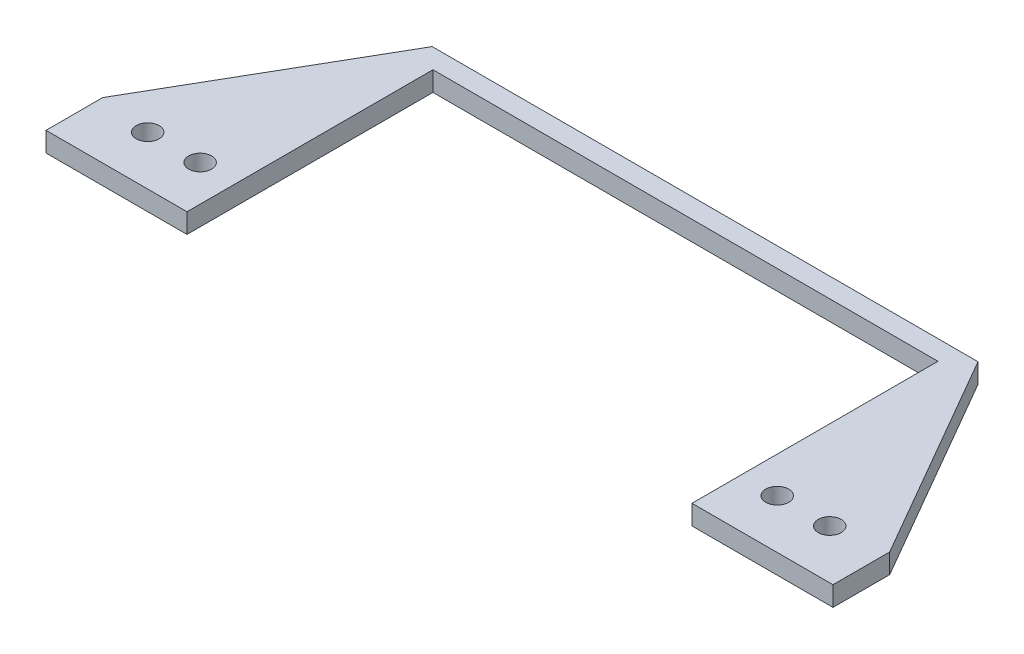
ISO-10303-21;
HEADER;
FILE_DESCRIPTION(('STEP AP214'),'2;1');
FILE_NAME('part.step','',(''),(''),'','','');
FILE_SCHEMA(('AUTOMOTIVE_DESIGN { 1 0 10303 214 1 1 1 1 }'));
ENDSEC;
DATA;
#1=APPLICATION_CONTEXT('core data for automotive mechanical design processes');
#2=APPLICATION_PROTOCOL_DEFINITION('international standard','automotive_design',2000,#1);
#3=PRODUCT_CONTEXT('',#1,'mechanical');
#4=PRODUCT('Part','Part','',(#3));
#5=PRODUCT_RELATED_PRODUCT_CATEGORY('part','',(#4));
#6=PRODUCT_DEFINITION_FORMATION('','',#4);
#7=PRODUCT_DEFINITION_CONTEXT('part definition',#1,'design');
#8=PRODUCT_DEFINITION('design','',#6,#7);
#9=PRODUCT_DEFINITION_SHAPE('','',#8);
#10=(LENGTH_UNIT() NAMED_UNIT(*) SI_UNIT(.MILLI.,.METRE.));
#11=(NAMED_UNIT(*) PLANE_ANGLE_UNIT() SI_UNIT($,.RADIAN.));
#12=(NAMED_UNIT(*) SI_UNIT($,.STERADIAN.) SOLID_ANGLE_UNIT());
#13=UNCERTAINTY_MEASURE_WITH_UNIT(LENGTH_MEASURE(1.E-05),#10,'distance_accuracy_value','');
#14=(GEOMETRIC_REPRESENTATION_CONTEXT(3) GLOBAL_UNCERTAINTY_ASSIGNED_CONTEXT((#13)) GLOBAL_UNIT_ASSIGNED_CONTEXT((#10,
#11,#12)) REPRESENTATION_CONTEXT('',''));
#15=CARTESIAN_POINT('',(0.,0.,0.));
#16=DIRECTION('',(0.,0.,1.));
#17=DIRECTION('',(1.,0.,0.));
#18=AXIS2_PLACEMENT_3D('',#15,#16,#17);
#19=CARTESIAN_POINT('',(41.6113939263104,3.,-23.0814356435643));
#20=DIRECTION('',(-0.866025403784438,0.,0.500000000000001));
#21=DIRECTION('',(0.500000000000001,0.,0.866025403784438));
#22=AXIS2_PLACEMENT_3D('',#19,#20,#21);
#23=PLANE('',#22);
#24=DIRECTION('',(-0.500000000000001,0.,-0.866025403784438));
#25=VECTOR('',#24,1.);
#26=CARTESIAN_POINT('',(41.6113939263104,0.,-23.0814356435643));
#27=LINE('',#26,#25);
#28=CARTESIAN_POINT('',(60.,0.,8.76856435643566));
#29=VERTEX_POINT('',#28);
#30=CARTESIAN_POINT('',(41.6113939263104,0.,-23.0814356435643));
#31=VERTEX_POINT('',#30);
#32=EDGE_CURVE('E141',#29,#31,#27,.T.);
#33=ORIENTED_EDGE('',*,*,#32,.T.);
#34=DIRECTION('',(0.,-1.,0.));
#35=VECTOR('',#34,1.);
#36=CARTESIAN_POINT('',(41.6113939263104,3.,-23.0814356435643));
#37=LINE('',#36,#35);
#38=CARTESIAN_POINT('',(41.6113939263104,3.,-23.0814356435643));
#39=VERTEX_POINT('',#38);
#40=EDGE_CURVE('E11',#39,#31,#37,.T.);
#41=ORIENTED_EDGE('',*,*,#40,.F.);
#42=DIRECTION('',(-0.500000000000001,0.,-0.866025403784438));
#43=VECTOR('',#42,1.);
#44=CARTESIAN_POINT('',(41.6113939263104,3.,-23.0814356435643));
#45=LINE('',#44,#43);
#46=CARTESIAN_POINT('',(60.,3.,8.76856435643566));
#47=VERTEX_POINT('',#46);
#48=EDGE_CURVE('E160',#47,#39,#45,.T.);
#49=ORIENTED_EDGE('',*,*,#48,.F.);
#50=DIRECTION('',(0.,-1.,0.));
#51=VECTOR('',#50,1.);
#52=CARTESIAN_POINT('',(60.,3.,8.76856435643566));
#53=LINE('',#52,#51);
#54=EDGE_CURVE('E137',#47,#29,#53,.T.);
#55=ORIENTED_EDGE('',*,*,#54,.T.);
#56=EDGE_LOOP('',(#33,#41,#49,#55));
#57=FACE_BOUND('',#56,.T.);
#58=ADVANCED_FACE('F33',(#57),#23,.F.);
#59=CARTESIAN_POINT('',(-41.6113939263104,3.,-23.0814356435643));
#60=DIRECTION('',(0.,0.,1.));
#61=DIRECTION('',(1.,0.,0.));
#62=AXIS2_PLACEMENT_3D('',#59,#60,#61);
#63=PLANE('',#62);
#64=DIRECTION('',(-1.,0.,0.));
#65=VECTOR('',#64,1.);
#66=CARTESIAN_POINT('',(-41.6113939263104,0.,-23.0814356435643));
#67=LINE('',#66,#65);
#68=CARTESIAN_POINT('',(-41.6113939263104,0.,-23.0814356435643));
#69=VERTEX_POINT('',#68);
#70=EDGE_CURVE('E144',#31,#69,#67,.T.);
#71=ORIENTED_EDGE('',*,*,#70,.T.);
#72=DIRECTION('',(0.,-1.,0.));
#73=VECTOR('',#72,1.);
#74=CARTESIAN_POINT('',(-41.6113939263104,3.,-23.0814356435643));
#75=LINE('',#74,#73);
#76=CARTESIAN_POINT('',(-41.6113939263104,3.,-23.0814356435643));
#77=VERTEX_POINT('',#76);
#78=EDGE_CURVE('E41',#77,#69,#75,.T.);
#79=ORIENTED_EDGE('',*,*,#78,.F.);
#80=DIRECTION('',(-1.,0.,0.));
#81=VECTOR('',#80,1.);
#82=CARTESIAN_POINT('',(-41.6113939263104,3.,-23.0814356435643));
#83=LINE('',#82,#81);
#84=EDGE_CURVE('E98',#39,#77,#83,.T.);
#85=ORIENTED_EDGE('',*,*,#84,.F.);
#86=ORIENTED_EDGE('',*,*,#40,.T.);
#87=EDGE_LOOP('',(#71,#79,#85,#86));
#88=FACE_BOUND('',#87,.T.);
#89=ADVANCED_FACE('F265',(#88),#63,.F.);
#90=CARTESIAN_POINT('',(-41.6113939263104,3.,-23.0814356435643));
#91=DIRECTION('',(0.866025403784438,0.,0.500000000000001));
#92=DIRECTION('',(0.500000000000001,0.,-0.866025403784438));
#93=AXIS2_PLACEMENT_3D('',#90,#91,#92);
#94=PLANE('',#93);
#95=DIRECTION('',(-0.500000000000001,0.,0.866025403784438));
#96=VECTOR('',#95,1.);
#97=CARTESIAN_POINT('',(-41.6113939263104,0.,-23.0814356435643));
#98=LINE('',#97,#96);
#99=CARTESIAN_POINT('',(-60.,0.,8.76856435643567));
#100=VERTEX_POINT('',#99);
#101=EDGE_CURVE('E147',#69,#100,#98,.T.);
#102=ORIENTED_EDGE('',*,*,#101,.T.);
#103=DIRECTION('',(0.,-1.,0.));
#104=VECTOR('',#103,1.);
#105=CARTESIAN_POINT('',(-60.,3.,8.76856435643567));
#106=LINE('',#105,#104);
#107=CARTESIAN_POINT('',(-60.,3.,8.76856435643567));
#108=VERTEX_POINT('',#107);
#109=EDGE_CURVE('E173',#108,#100,#106,.T.);
#110=ORIENTED_EDGE('',*,*,#109,.F.);
#111=DIRECTION('',(-0.500000000000001,0.,0.866025403784438));
#112=VECTOR('',#111,1.);
#113=CARTESIAN_POINT('',(-41.6113939263104,3.,-23.0814356435643));
#114=LINE('',#113,#112);
#115=EDGE_CURVE('E181',#77,#108,#114,.T.);
#116=ORIENTED_EDGE('',*,*,#115,.F.);
#117=ORIENTED_EDGE('',*,*,#78,.T.);
#118=EDGE_LOOP('',(#102,#110,#116,#117));
#119=FACE_BOUND('',#118,.T.);
#120=ADVANCED_FACE('F179',(#119),#94,.F.);
#121=CARTESIAN_POINT('',(-60.,3.,8.76856435643567));
#122=DIRECTION('',(1.,0.,0.));
#123=DIRECTION('',(0.,0.,-1.));
#124=AXIS2_PLACEMENT_3D('',#121,#122,#123);
#125=PLANE('',#124);
#126=DIRECTION('',(0.,0.,1.));
#127=VECTOR('',#126,1.);
#128=CARTESIAN_POINT('',(-60.,0.,8.76856435643567));
#129=LINE('',#128,#127);
#130=CARTESIAN_POINT('',(-60.,0.,17.4185643564357));
#131=VERTEX_POINT('',#130);
#132=EDGE_CURVE('E149',#100,#131,#129,.T.);
#133=ORIENTED_EDGE('',*,*,#132,.T.);
#134=DIRECTION('',(0.,-1.,0.));
#135=VECTOR('',#134,1.);
#136=CARTESIAN_POINT('',(-60.,3.,17.4185643564357));
#137=LINE('',#136,#135);
#138=CARTESIAN_POINT('',(-60.,3.,17.4185643564357));
#139=VERTEX_POINT('',#138);
#140=EDGE_CURVE('E170',#139,#131,#137,.T.);
#141=ORIENTED_EDGE('',*,*,#140,.F.);
#142=DIRECTION('',(0.,0.,1.));
#143=VECTOR('',#142,1.);
#144=CARTESIAN_POINT('',(-60.,3.,8.76856435643567));
#145=LINE('',#144,#143);
#146=EDGE_CURVE('E199',#108,#139,#145,.T.);
#147=ORIENTED_EDGE('',*,*,#146,.F.);
#148=ORIENTED_EDGE('',*,*,#109,.T.);
#149=EDGE_LOOP('',(#133,#141,#147,#148));
#150=FACE_BOUND('',#149,.T.);
#151=ADVANCED_FACE('F190',(#150),#125,.F.);
#152=CARTESIAN_POINT('',(-60.,3.,17.4185643564357));
#153=DIRECTION('',(0.,0.,-1.));
#154=DIRECTION('',(-1.,0.,0.));
#155=AXIS2_PLACEMENT_3D('',#152,#153,#154);
#156=PLANE('',#155);
#157=DIRECTION('',(1.,0.,0.));
#158=VECTOR('',#157,1.);
#159=CARTESIAN_POINT('',(-60.,0.,17.4185643564357));
#160=LINE('',#159,#158);
#161=CARTESIAN_POINT('',(-38.5,0.,17.4185643564357));
#162=VERTEX_POINT('',#161);
#163=EDGE_CURVE('E151',#131,#162,#160,.T.);
#164=ORIENTED_EDGE('',*,*,#163,.T.);
#165=DIRECTION('',(0.,-1.,0.));
#166=VECTOR('',#165,1.);
#167=CARTESIAN_POINT('',(-38.5,3.,17.4185643564357));
#168=LINE('',#167,#166);
#169=CARTESIAN_POINT('',(-38.5,3.,17.4185643564357));
#170=VERTEX_POINT('',#169);
#171=EDGE_CURVE('E167',#170,#162,#168,.T.);
#172=ORIENTED_EDGE('',*,*,#171,.F.);
#173=DIRECTION('',(1.,0.,0.));
#174=VECTOR('',#173,1.);
#175=CARTESIAN_POINT('',(-60.,3.,17.4185643564357));
#176=LINE('',#175,#174);
#177=EDGE_CURVE('E196',#139,#170,#176,.T.);
#178=ORIENTED_EDGE('',*,*,#177,.F.);
#179=ORIENTED_EDGE('',*,*,#140,.T.);
#180=EDGE_LOOP('',(#164,#172,#178,#179));
#181=FACE_BOUND('',#180,.T.);
#182=ADVANCED_FACE('F194',(#181),#156,.F.);
#183=CARTESIAN_POINT('',(-38.5,3.,17.4185643564357));
#184=DIRECTION('',(-1.,0.,0.));
#185=DIRECTION('',(0.,0.,1.));
#186=AXIS2_PLACEMENT_3D('',#183,#184,#185);
#187=PLANE('',#186);
#188=DIRECTION('',(0.,0.,-1.));
#189=VECTOR('',#188,1.);
#190=CARTESIAN_POINT('',(-38.5,0.,17.4185643564357));
#191=LINE('',#190,#189);
#192=CARTESIAN_POINT('',(-38.5,0.,-20.0814356435643));
#193=VERTEX_POINT('',#192);
#194=EDGE_CURVE('E153',#162,#193,#191,.T.);
#195=ORIENTED_EDGE('',*,*,#194,.T.);
#196=DIRECTION('',(0.,-1.,0.));
#197=VECTOR('',#196,1.);
#198=CARTESIAN_POINT('',(-38.5,3.,-20.0814356435643));
#199=LINE('',#198,#197);
#200=CARTESIAN_POINT('',(-38.5,3.,-20.0814356435643));
#201=VERTEX_POINT('',#200);
#202=EDGE_CURVE('E164',#201,#193,#199,.T.);
#203=ORIENTED_EDGE('',*,*,#202,.F.);
#204=DIRECTION('',(0.,0.,-1.));
#205=VECTOR('',#204,1.);
#206=CARTESIAN_POINT('',(-38.5,3.,17.4185643564357));
#207=LINE('',#206,#205);
#208=EDGE_CURVE('E198',#170,#201,#207,.T.);
#209=ORIENTED_EDGE('',*,*,#208,.F.);
#210=ORIENTED_EDGE('',*,*,#171,.T.);
#211=EDGE_LOOP('',(#195,#203,#209,#210));
#212=FACE_BOUND('',#211,.T.);
#213=ADVANCED_FACE('F277',(#212),#187,.F.);
#214=CARTESIAN_POINT('',(38.5,3.,-20.0814356435643));
#215=DIRECTION('',(0.,0.,-1.));
#216=DIRECTION('',(-1.,0.,0.));
#217=AXIS2_PLACEMENT_3D('',#214,#215,#216);
#218=PLANE('',#217);
#219=DIRECTION('',(1.,0.,0.));
#220=VECTOR('',#219,1.);
#221=CARTESIAN_POINT('',(38.5,0.,-20.0814356435643));
#222=LINE('',#221,#220);
#223=CARTESIAN_POINT('',(38.5,0.,-20.0814356435643));
#224=VERTEX_POINT('',#223);
#225=EDGE_CURVE('E155',#193,#224,#222,.T.);
#226=ORIENTED_EDGE('',*,*,#225,.T.);
#227=DIRECTION('',(0.,-1.,0.));
#228=VECTOR('',#227,1.);
#229=CARTESIAN_POINT('',(38.5,3.,-20.0814356435643));
#230=LINE('',#229,#228);
#231=CARTESIAN_POINT('',(38.5,3.,-20.0814356435643));
#232=VERTEX_POINT('',#231);
#233=EDGE_CURVE('E132',#232,#224,#230,.T.);
#234=ORIENTED_EDGE('',*,*,#233,.F.);
#235=DIRECTION('',(1.,0.,0.));
#236=VECTOR('',#235,1.);
#237=CARTESIAN_POINT('',(38.5,3.,-20.0814356435643));
#238=LINE('',#237,#236);
#239=EDGE_CURVE('E123',#201,#232,#238,.T.);
#240=ORIENTED_EDGE('',*,*,#239,.F.);
#241=ORIENTED_EDGE('',*,*,#202,.T.);
#242=EDGE_LOOP('',(#226,#234,#240,#241));
#243=FACE_BOUND('',#242,.T.);
#244=ADVANCED_FACE('F274',(#243),#218,.F.);
#245=CARTESIAN_POINT('',(38.5,3.,17.4185643564357));
#246=DIRECTION('',(1.,0.,0.));
#247=DIRECTION('',(0.,0.,-1.));
#248=AXIS2_PLACEMENT_3D('',#245,#246,#247);
#249=PLANE('',#248);
#250=DIRECTION('',(0.,0.,1.));
#251=VECTOR('',#250,1.);
#252=CARTESIAN_POINT('',(38.5,0.,17.4185643564357));
#253=LINE('',#252,#251);
#254=CARTESIAN_POINT('',(38.5,0.,17.4185643564357));
#255=VERTEX_POINT('',#254);
#256=EDGE_CURVE('E131',#224,#255,#253,.T.);
#257=ORIENTED_EDGE('',*,*,#256,.T.);
#258=DIRECTION('',(0.,-1.,0.));
#259=VECTOR('',#258,1.);
#260=CARTESIAN_POINT('',(38.5,3.,17.4185643564357));
#261=LINE('',#260,#259);
#262=CARTESIAN_POINT('',(38.5,3.,17.4185643564357));
#263=VERTEX_POINT('',#262);
#264=EDGE_CURVE('E128',#263,#255,#261,.T.);
#265=ORIENTED_EDGE('',*,*,#264,.F.);
#266=DIRECTION('',(0.,0.,1.));
#267=VECTOR('',#266,1.);
#268=CARTESIAN_POINT('',(38.5,3.,17.4185643564357));
#269=LINE('',#268,#267);
#270=EDGE_CURVE('E117',#232,#263,#269,.T.);
#271=ORIENTED_EDGE('',*,*,#270,.F.);
#272=ORIENTED_EDGE('',*,*,#233,.T.);
#273=EDGE_LOOP('',(#257,#265,#271,#272));
#274=FACE_BOUND('',#273,.T.);
#275=ADVANCED_FACE('F129',(#274),#249,.F.);
#276=CARTESIAN_POINT('',(60.,3.,17.4185643564357));
#277=DIRECTION('',(0.,0.,-1.));
#278=DIRECTION('',(-1.,0.,0.));
#279=AXIS2_PLACEMENT_3D('',#276,#277,#278);
#280=PLANE('',#279);
#281=DIRECTION('',(1.,0.,0.));
#282=VECTOR('',#281,1.);
#283=CARTESIAN_POINT('',(60.,0.,17.4185643564357));
#284=LINE('',#283,#282);
#285=CARTESIAN_POINT('',(60.,0.,17.4185643564357));
#286=VERTEX_POINT('',#285);
#287=EDGE_CURVE('E84',#255,#286,#284,.T.);
#288=ORIENTED_EDGE('',*,*,#287,.T.);
#289=DIRECTION('',(0.,-1.,0.));
#290=VECTOR('',#289,1.);
#291=CARTESIAN_POINT('',(60.,3.,17.4185643564357));
#292=LINE('',#291,#290);
#293=CARTESIAN_POINT('',(60.,3.,17.4185643564357));
#294=VERTEX_POINT('',#293);
#295=EDGE_CURVE('E133',#294,#286,#292,.T.);
#296=ORIENTED_EDGE('',*,*,#295,.F.);
#297=DIRECTION('',(1.,0.,0.));
#298=VECTOR('',#297,1.);
#299=CARTESIAN_POINT('',(60.,3.,17.4185643564357));
#300=LINE('',#299,#298);
#301=EDGE_CURVE('E121',#263,#294,#300,.T.);
#302=ORIENTED_EDGE('',*,*,#301,.F.);
#303=ORIENTED_EDGE('',*,*,#264,.T.);
#304=EDGE_LOOP('',(#288,#296,#302,#303));
#305=FACE_BOUND('',#304,.T.);
#306=ADVANCED_FACE('F135',(#305),#280,.F.);
#307=CARTESIAN_POINT('',(60.,3.,8.76856435643566));
#308=DIRECTION('',(-1.,0.,0.));
#309=DIRECTION('',(0.,0.,1.));
#310=AXIS2_PLACEMENT_3D('',#307,#308,#309);
#311=PLANE('',#310);
#312=DIRECTION('',(0.,0.,-1.));
#313=VECTOR('',#312,1.);
#314=CARTESIAN_POINT('',(60.,0.,8.76856435643566));
#315=LINE('',#314,#313);
#316=EDGE_CURVE('E90',#286,#29,#315,.T.);
#317=ORIENTED_EDGE('',*,*,#316,.T.);
#318=ORIENTED_EDGE('',*,*,#54,.F.);
#319=DIRECTION('',(0.,0.,-1.));
#320=VECTOR('',#319,1.);
#321=CARTESIAN_POINT('',(60.,3.,8.76856435643566));
#322=LINE('',#321,#320);
#323=EDGE_CURVE('E49',#294,#47,#322,.T.);
#324=ORIENTED_EDGE('',*,*,#323,.F.);
#325=ORIENTED_EDGE('',*,*,#295,.T.);
#326=EDGE_LOOP('',(#317,#318,#324,#325));
#327=FACE_BOUND('',#326,.T.);
#328=ADVANCED_FACE('F242',(#327),#311,.F.);
#329=CARTESIAN_POINT('',(0.,3.,0.));
#330=DIRECTION('',(0.,-1.,0.));
#331=DIRECTION('',(0.,0.,-1.));
#332=AXIS2_PLACEMENT_3D('',#329,#330,#331);
#333=PLANE('',#332);
#334=CARTESIAN_POINT('',(52.,3.,9.91856435643566));
#335=DIRECTION('',(0.,1.,0.));
#336=DIRECTION('',(0.,0.,1.));
#337=AXIS2_PLACEMENT_3D('',#334,#335,#336);
#338=CIRCLE('',#337,1.75);
#339=CARTESIAN_POINT('',(52.,3.,11.6685643564357));
#340=VERTEX_POINT('',#339);
#341=EDGE_CURVE('E220',#340,#340,#338,.T.);
#342=ORIENTED_EDGE('',*,*,#341,.F.);
#343=EDGE_LOOP('',(#342));
#344=FACE_BOUND('',#343,.T.);
#345=CARTESIAN_POINT('',(-44.,3.,9.91856435643567));
#346=DIRECTION('',(0.,1.,0.));
#347=DIRECTION('',(0.,0.,-1.));
#348=AXIS2_PLACEMENT_3D('',#345,#346,#347);
#349=CIRCLE('',#348,1.75);
#350=CARTESIAN_POINT('',(-44.,3.,8.16856435643567));
#351=VERTEX_POINT('',#350);
#352=EDGE_CURVE('E221',#351,#351,#349,.T.);
#353=ORIENTED_EDGE('',*,*,#352,.F.);
#354=EDGE_LOOP('',(#353));
#355=FACE_BOUND('',#354,.T.);
#356=CARTESIAN_POINT('',(-52.,3.,9.91856435643567));
#357=DIRECTION('',(0.,1.,0.));
#358=DIRECTION('',(0.,0.,-1.));
#359=AXIS2_PLACEMENT_3D('',#356,#357,#358);
#360=CIRCLE('',#359,1.75);
#361=CARTESIAN_POINT('',(-52.,3.,8.16856435643567));
#362=VERTEX_POINT('',#361);
#363=EDGE_CURVE('E207',#362,#362,#360,.T.);
#364=ORIENTED_EDGE('',*,*,#363,.F.);
#365=EDGE_LOOP('',(#364));
#366=FACE_BOUND('',#365,.T.);
#367=CARTESIAN_POINT('',(44.,3.,9.91856435643566));
#368=DIRECTION('',(0.,1.,0.));
#369=DIRECTION('',(0.,0.,1.));
#370=AXIS2_PLACEMENT_3D('',#367,#368,#369);
#371=CIRCLE('',#370,1.75);
#372=CARTESIAN_POINT('',(44.,3.,11.6685643564357));
#373=VERTEX_POINT('',#372);
#374=EDGE_CURVE('E214',#373,#373,#371,.T.);
#375=ORIENTED_EDGE('',*,*,#374,.F.);
#376=EDGE_LOOP('',(#375));
#377=FACE_BOUND('',#376,.T.);
#378=ORIENTED_EDGE('',*,*,#48,.T.);
#379=ORIENTED_EDGE('',*,*,#84,.T.);
#380=ORIENTED_EDGE('',*,*,#115,.T.);
#381=ORIENTED_EDGE('',*,*,#146,.T.);
#382=ORIENTED_EDGE('',*,*,#177,.T.);
#383=ORIENTED_EDGE('',*,*,#208,.T.);
#384=ORIENTED_EDGE('',*,*,#239,.T.);
#385=ORIENTED_EDGE('',*,*,#270,.T.);
#386=ORIENTED_EDGE('',*,*,#301,.T.);
#387=ORIENTED_EDGE('',*,*,#323,.T.);
#388=EDGE_LOOP('',(#378,#379,#380,#381,#382,#383,#384,#385,#386,#387));
#389=FACE_BOUND('',#388,.T.);
#390=ADVANCED_FACE('F119',(#344,#355,#366,#377,#389),#333,.F.);
#391=CARTESIAN_POINT('',(0.,0.,0.));
#392=DIRECTION('',(0.,-1.,0.));
#393=DIRECTION('',(0.,0.,-1.));
#394=AXIS2_PLACEMENT_3D('',#391,#392,#393);
#395=PLANE('',#394);
#396=CARTESIAN_POINT('',(52.,0.,9.91856435643566));
#397=DIRECTION('',(0.,1.,0.));
#398=DIRECTION('',(0.,0.,1.));
#399=AXIS2_PLACEMENT_3D('',#396,#397,#398);
#400=CIRCLE('',#399,1.75);
#401=CARTESIAN_POINT('',(52.,0.,11.6685643564357));
#402=VERTEX_POINT('',#401);
#403=EDGE_CURVE('E145',#402,#402,#400,.T.);
#404=ORIENTED_EDGE('',*,*,#403,.T.);
#405=EDGE_LOOP('',(#404));
#406=FACE_BOUND('',#405,.T.);
#407=CARTESIAN_POINT('',(-44.,0.,9.91856435643567));
#408=DIRECTION('',(0.,1.,0.));
#409=DIRECTION('',(0.,0.,-1.));
#410=AXIS2_PLACEMENT_3D('',#407,#408,#409);
#411=CIRCLE('',#410,1.75);
#412=CARTESIAN_POINT('',(-44.,0.,8.16856435643567));
#413=VERTEX_POINT('',#412);
#414=EDGE_CURVE('E211',#413,#413,#411,.T.);
#415=ORIENTED_EDGE('',*,*,#414,.T.);
#416=EDGE_LOOP('',(#415));
#417=FACE_BOUND('',#416,.T.);
#418=CARTESIAN_POINT('',(-52.,0.,9.91856435643567));
#419=DIRECTION('',(0.,1.,0.));
#420=DIRECTION('',(0.,0.,-1.));
#421=AXIS2_PLACEMENT_3D('',#418,#419,#420);
#422=CIRCLE('',#421,1.75);
#423=CARTESIAN_POINT('',(-52.,0.,8.16856435643567));
#424=VERTEX_POINT('',#423);
#425=EDGE_CURVE('E210',#424,#424,#422,.T.);
#426=ORIENTED_EDGE('',*,*,#425,.T.);
#427=EDGE_LOOP('',(#426));
#428=FACE_BOUND('',#427,.T.);
#429=CARTESIAN_POINT('',(44.,0.,9.91856435643566));
#430=DIRECTION('',(0.,1.,0.));
#431=DIRECTION('',(0.,0.,1.));
#432=AXIS2_PLACEMENT_3D('',#429,#430,#431);
#433=CIRCLE('',#432,1.75);
#434=CARTESIAN_POINT('',(44.,0.,11.6685643564357));
#435=VERTEX_POINT('',#434);
#436=EDGE_CURVE('E217',#435,#435,#433,.T.);
#437=ORIENTED_EDGE('',*,*,#436,.T.);
#438=EDGE_LOOP('',(#437));
#439=FACE_BOUND('',#438,.T.);
#440=ORIENTED_EDGE('',*,*,#32,.F.);
#441=ORIENTED_EDGE('',*,*,#316,.F.);
#442=ORIENTED_EDGE('',*,*,#287,.F.);
#443=ORIENTED_EDGE('',*,*,#256,.F.);
#444=ORIENTED_EDGE('',*,*,#225,.F.);
#445=ORIENTED_EDGE('',*,*,#194,.F.);
#446=ORIENTED_EDGE('',*,*,#163,.F.);
#447=ORIENTED_EDGE('',*,*,#132,.F.);
#448=ORIENTED_EDGE('',*,*,#101,.F.);
#449=ORIENTED_EDGE('',*,*,#70,.F.);
#450=EDGE_LOOP('',(#440,#441,#442,#443,#444,#445,#446,#447,#448,#449));
#451=FACE_BOUND('',#450,.T.);
#452=ADVANCED_FACE('F185',(#406,#417,#428,#439,#451),#395,.T.);
#453=CARTESIAN_POINT('',(44.,0.,9.91856435643566));
#454=DIRECTION('',(0.,1.,0.));
#455=DIRECTION('',(0.,0.,1.));
#456=AXIS2_PLACEMENT_3D('',#453,#454,#455);
#457=CYLINDRICAL_SURFACE('',#456,1.75);
#458=ORIENTED_EDGE('',*,*,#436,.F.);
#459=EDGE_LOOP('',(#458));
#460=FACE_BOUND('',#459,.T.);
#461=ORIENTED_EDGE('',*,*,#374,.T.);
#462=EDGE_LOOP('',(#461));
#463=FACE_BOUND('',#462,.T.);
#464=ADVANCED_FACE('F250',(#460,#463),#457,.F.);
#465=CARTESIAN_POINT('',(-52.,0.,9.91856435643567));
#466=DIRECTION('',(0.,1.,0.));
#467=DIRECTION('',(0.,0.,1.));
#468=AXIS2_PLACEMENT_3D('',#465,#466,#467);
#469=CYLINDRICAL_SURFACE('',#468,1.75);
#470=ORIENTED_EDGE('',*,*,#425,.F.);
#471=EDGE_LOOP('',(#470));
#472=FACE_BOUND('',#471,.T.);
#473=ORIENTED_EDGE('',*,*,#363,.T.);
#474=EDGE_LOOP('',(#473));
#475=FACE_BOUND('',#474,.T.);
#476=ADVANCED_FACE('F252',(#472,#475),#469,.F.);
#477=CARTESIAN_POINT('',(-44.,0.,9.91856435643567));
#478=DIRECTION('',(0.,1.,0.));
#479=DIRECTION('',(0.,0.,1.));
#480=AXIS2_PLACEMENT_3D('',#477,#478,#479);
#481=CYLINDRICAL_SURFACE('',#480,1.75);
#482=ORIENTED_EDGE('',*,*,#414,.F.);
#483=EDGE_LOOP('',(#482));
#484=FACE_BOUND('',#483,.T.);
#485=ORIENTED_EDGE('',*,*,#352,.T.);
#486=EDGE_LOOP('',(#485));
#487=FACE_BOUND('',#486,.T.);
#488=ADVANCED_FACE('F236',(#484,#487),#481,.F.);
#489=CARTESIAN_POINT('',(52.,0.,9.91856435643566));
#490=DIRECTION('',(0.,1.,0.));
#491=DIRECTION('',(0.,0.,1.));
#492=AXIS2_PLACEMENT_3D('',#489,#490,#491);
#493=CYLINDRICAL_SURFACE('',#492,1.75);
#494=ORIENTED_EDGE('',*,*,#403,.F.);
#495=EDGE_LOOP('',(#494));
#496=FACE_BOUND('',#495,.T.);
#497=ORIENTED_EDGE('',*,*,#341,.T.);
#498=EDGE_LOOP('',(#497));
#499=FACE_BOUND('',#498,.T.);
#500=ADVANCED_FACE('F233',(#496,#499),#493,.F.);
#501=CLOSED_SHELL('',(#58,#89,#120,#151,#182,#213,#244,#275,#306,#328,#390,#452,#464,#476,#488,#500));
#502=MANIFOLD_SOLID_BREP('B2',#501);
#503=ADVANCED_BREP_SHAPE_REPRESENTATION('',(#18,#502),#14);
#504=SHAPE_DEFINITION_REPRESENTATION(#9,#503);
ENDSEC;
END-ISO-10303-21;
